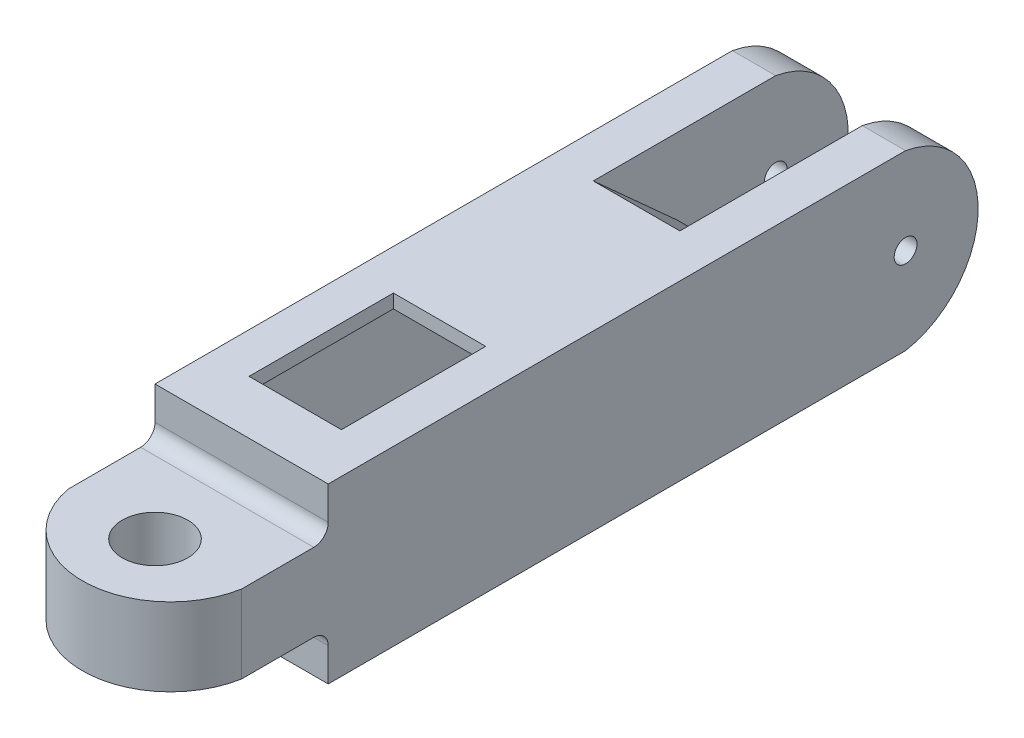
ISO-10303-21;
HEADER;
FILE_DESCRIPTION(('STEP AP214'),'2;1');
FILE_NAME('part.step','',(''),(''),'','','');
FILE_SCHEMA(('AUTOMOTIVE_DESIGN { 1 0 10303 214 1 1 1 1 }'));
ENDSEC;
DATA;
#1=APPLICATION_CONTEXT('core data for automotive mechanical design processes');
#2=APPLICATION_PROTOCOL_DEFINITION('international standard','automotive_design',2000,#1);
#3=PRODUCT_CONTEXT('',#1,'mechanical');
#4=PRODUCT('Part','Part','',(#3));
#5=PRODUCT_RELATED_PRODUCT_CATEGORY('part','',(#4));
#6=PRODUCT_DEFINITION_FORMATION('','',#4);
#7=PRODUCT_DEFINITION_CONTEXT('part definition',#1,'design');
#8=PRODUCT_DEFINITION('design','',#6,#7);
#9=PRODUCT_DEFINITION_SHAPE('','',#8);
#10=(LENGTH_UNIT() NAMED_UNIT(*) SI_UNIT(.MILLI.,.METRE.));
#11=(NAMED_UNIT(*) PLANE_ANGLE_UNIT() SI_UNIT($,.RADIAN.));
#12=(NAMED_UNIT(*) SI_UNIT($,.STERADIAN.) SOLID_ANGLE_UNIT());
#13=UNCERTAINTY_MEASURE_WITH_UNIT(LENGTH_MEASURE(1.E-05),#10,'distance_accuracy_value','');
#14=(GEOMETRIC_REPRESENTATION_CONTEXT(3) GLOBAL_UNCERTAINTY_ASSIGNED_CONTEXT((#13)) GLOBAL_UNIT_ASSIGNED_CONTEXT((#10,
#11,#12)) REPRESENTATION_CONTEXT('',''));
#15=CARTESIAN_POINT('',(0.,0.,0.));
#16=DIRECTION('',(0.,0.,1.));
#17=DIRECTION('',(1.,0.,0.));
#18=AXIS2_PLACEMENT_3D('',#15,#16,#17);
#19=CARTESIAN_POINT('',(0.,0.,170.));
#20=DIRECTION('',(0.,0.,1.));
#21=DIRECTION('',(1.,0.,0.));
#22=AXIS2_PLACEMENT_3D('',#19,#20,#21);
#23=PLANE('',#22);
#24=DIRECTION('',(0.,1.,0.));
#25=VECTOR('',#24,1.);
#26=CARTESIAN_POINT('',(30.,30.,170.));
#27=LINE('',#26,#25);
#28=CARTESIAN_POINT('',(30.,-30.,170.));
#29=VERTEX_POINT('',#28);
#30=CARTESIAN_POINT('',(30.,-18.5,170.));
#31=VERTEX_POINT('',#30);
#32=EDGE_CURVE('E481',#29,#31,#27,.T.);
#33=ORIENTED_EDGE('',*,*,#32,.T.);
#34=DIRECTION('',(1.,0.,0.));
#35=VECTOR('',#34,1.);
#36=CARTESIAN_POINT('',(0.,-18.5,170.));
#37=LINE('',#36,#35);
#38=CARTESIAN_POINT('',(-30.,-18.5,170.));
#39=VERTEX_POINT('',#38);
#40=EDGE_CURVE('E527',#31,#39,#37,.F.);
#41=ORIENTED_EDGE('',*,*,#40,.T.);
#42=DIRECTION('',(0.,-1.,0.));
#43=VECTOR('',#42,1.);
#44=CARTESIAN_POINT('',(-30.,30.,170.));
#45=LINE('',#44,#43);
#46=CARTESIAN_POINT('',(-30.,-30.,170.));
#47=VERTEX_POINT('',#46);
#48=EDGE_CURVE('E488',#39,#47,#45,.T.);
#49=ORIENTED_EDGE('',*,*,#48,.T.);
#50=DIRECTION('',(1.,0.,0.));
#51=VECTOR('',#50,1.);
#52=CARTESIAN_POINT('',(-30.,-30.,170.));
#53=LINE('',#52,#51);
#54=EDGE_CURVE('E493',#47,#29,#53,.T.);
#55=ORIENTED_EDGE('',*,*,#54,.T.);
#56=EDGE_LOOP('',(#33,#41,#49,#55));
#57=FACE_BOUND('',#56,.T.);
#58=ADVANCED_FACE('F57',(#57),#23,.T.);
#59=CARTESIAN_POINT('',(30.,30.,170.));
#60=DIRECTION('',(-1.,0.,0.));
#61=DIRECTION('',(0.,-1.,0.));
#62=AXIS2_PLACEMENT_3D('',#59,#60,#61);
#63=PLANE('',#62);
#64=CARTESIAN_POINT('',(30.,0.,-30.));
#65=DIRECTION('',(-1.,0.,0.));
#66=DIRECTION('',(0.,-1.,0.));
#67=AXIS2_PLACEMENT_3D('',#64,#65,#66);
#68=CIRCLE('',#67,3.95);
#69=CARTESIAN_POINT('',(30.,-3.95000000000001,-30.));
#70=VERTEX_POINT('',#69);
#71=EDGE_CURVE('E347',#70,#70,#68,.T.);
#72=ORIENTED_EDGE('',*,*,#71,.T.);
#73=EDGE_LOOP('',(#72));
#74=FACE_BOUND('',#73,.T.);
#75=DIRECTION('',(0.,0.,-1.));
#76=VECTOR('',#75,1.);
#77=CARTESIAN_POINT('',(30.,-30.,170.));
#78=LINE('',#77,#76);
#79=CARTESIAN_POINT('',(30.,-30.,-30.));
#80=VERTEX_POINT('',#79);
#81=EDGE_CURVE('E496',#29,#80,#78,.T.);
#82=ORIENTED_EDGE('',*,*,#81,.T.);
#83=CARTESIAN_POINT('',(30.,0.,-24.6688744152853));
#84=DIRECTION('',(1.,0.,0.));
#85=DIRECTION('',(0.,-1.,0.));
#86=AXIS2_PLACEMENT_3D('',#83,#84,#85);
#87=CIRCLE('',#86,30.47);
#88=CARTESIAN_POINT('',(30.,30.,-30.));
#89=VERTEX_POINT('',#88);
#90=EDGE_CURVE('E441',#80,#89,#87,.T.);
#91=ORIENTED_EDGE('',*,*,#90,.T.);
#92=DIRECTION('',(0.,0.,-1.));
#93=VECTOR('',#92,1.);
#94=CARTESIAN_POINT('',(30.,30.,170.));
#95=LINE('',#94,#93);
#96=CARTESIAN_POINT('',(30.,30.,170.));
#97=VERTEX_POINT('',#96);
#98=EDGE_CURVE('E507',#97,#89,#95,.T.);
#99=ORIENTED_EDGE('',*,*,#98,.F.);
#100=CARTESIAN_POINT('',(30.,18.5,170.));
#101=VERTEX_POINT('',#100);
#102=EDGE_CURVE('E480',#101,#97,#27,.T.);
#103=ORIENTED_EDGE('',*,*,#102,.F.);
#104=CARTESIAN_POINT('',(30.,18.5,175.));
#105=DIRECTION('',(-1.,0.,0.));
#106=DIRECTION('',(0.,-1.,0.));
#107=AXIS2_PLACEMENT_3D('',#104,#105,#106);
#108=CIRCLE('',#107,5.);
#109=CARTESIAN_POINT('',(30.,13.5,175.));
#110=VERTEX_POINT('',#109);
#111=EDGE_CURVE('E546',#101,#110,#108,.T.);
#112=ORIENTED_EDGE('',*,*,#111,.T.);
#113=DIRECTION('',(0.,0.,-1.));
#114=VECTOR('',#113,1.);
#115=CARTESIAN_POINT('',(30.,13.5,200.));
#116=LINE('',#115,#114);
#117=CARTESIAN_POINT('',(30.,13.5,200.));
#118=VERTEX_POINT('',#117);
#119=EDGE_CURVE('E432',#118,#110,#116,.T.);
#120=ORIENTED_EDGE('',*,*,#119,.F.);
#121=DIRECTION('',(0.,1.,0.));
#122=VECTOR('',#121,1.);
#123=CARTESIAN_POINT('',(30.,13.5,200.));
#124=LINE('',#123,#122);
#125=CARTESIAN_POINT('',(30.,-13.5,200.));
#126=VERTEX_POINT('',#125);
#127=EDGE_CURVE('E409',#126,#118,#124,.T.);
#128=ORIENTED_EDGE('',*,*,#127,.F.);
#129=DIRECTION('',(0.,0.,-1.));
#130=VECTOR('',#129,1.);
#131=CARTESIAN_POINT('',(30.,-13.5,200.));
#132=LINE('',#131,#130);
#133=CARTESIAN_POINT('',(30.,-13.5,175.));
#134=VERTEX_POINT('',#133);
#135=EDGE_CURVE('E420',#126,#134,#132,.T.);
#136=ORIENTED_EDGE('',*,*,#135,.T.);
#137=CARTESIAN_POINT('',(30.,-18.5,175.));
#138=DIRECTION('',(-1.,0.,0.));
#139=DIRECTION('',(0.,-1.,0.));
#140=AXIS2_PLACEMENT_3D('',#137,#138,#139);
#141=CIRCLE('',#140,5.);
#142=EDGE_CURVE('E537',#134,#31,#141,.T.);
#143=ORIENTED_EDGE('',*,*,#142,.T.);
#144=ORIENTED_EDGE('',*,*,#32,.F.);
#145=EDGE_LOOP('',(#82,#91,#99,#103,#112,#120,#128,#136,#143,#144));
#146=FACE_BOUND('',#145,.T.);
#147=ADVANCED_FACE('F575',(#74,#146),#63,.F.);
#148=CARTESIAN_POINT('',(-30.,30.,170.));
#149=DIRECTION('',(0.,-1.,0.));
#150=DIRECTION('',(0.,0.,-1.));
#151=AXIS2_PLACEMENT_3D('',#148,#149,#150);
#152=PLANE('',#151);
#153=DIRECTION('',(-1.,0.,0.));
#154=VECTOR('',#153,1.);
#155=CARTESIAN_POINT('',(0.,30.,151.43));
#156=LINE('',#155,#154);
#157=CARTESIAN_POINT('',(16.,30.,151.43));
#158=VERTEX_POINT('',#157);
#159=CARTESIAN_POINT('',(-16.,30.,151.43));
#160=VERTEX_POINT('',#159);
#161=EDGE_CURVE('E259',#158,#160,#156,.T.);
#162=ORIENTED_EDGE('',*,*,#161,.T.);
#163=DIRECTION('',(0.,0.,1.));
#164=VECTOR('',#163,1.);
#165=CARTESIAN_POINT('',(-16.,30.,0.));
#166=LINE('',#165,#164);
#167=CARTESIAN_POINT('',(-16.,30.,101.43));
#168=VERTEX_POINT('',#167);
#169=EDGE_CURVE('E73',#168,#160,#166,.T.);
#170=ORIENTED_EDGE('',*,*,#169,.F.);
#171=DIRECTION('',(-1.,0.,0.));
#172=VECTOR('',#171,1.);
#173=CARTESIAN_POINT('',(0.,30.,101.43));
#174=LINE('',#173,#172);
#175=CARTESIAN_POINT('',(16.,30.,101.43));
#176=VERTEX_POINT('',#175);
#177=EDGE_CURVE('E268',#176,#168,#174,.T.);
#178=ORIENTED_EDGE('',*,*,#177,.F.);
#179=DIRECTION('',(0.,0.,1.));
#180=VECTOR('',#179,1.);
#181=CARTESIAN_POINT('',(16.,30.,0.));
#182=LINE('',#181,#180);
#183=EDGE_CURVE('E249',#176,#158,#182,.T.);
#184=ORIENTED_EDGE('',*,*,#183,.T.);
#185=EDGE_LOOP('',(#162,#170,#178,#184));
#186=FACE_BOUND('',#185,.T.);
#187=DIRECTION('',(0.,0.,1.));
#188=VECTOR('',#187,1.);
#189=CARTESIAN_POINT('',(15.,30.,-30.));
#190=LINE('',#189,#188);
#191=CARTESIAN_POINT('',(15.,30.,-30.));
#192=VERTEX_POINT('',#191);
#193=CARTESIAN_POINT('',(15.,30.,33.188384016313));
#194=VERTEX_POINT('',#193);
#195=EDGE_CURVE('E460',#192,#194,#190,.T.);
#196=ORIENTED_EDGE('',*,*,#195,.T.);
#197=DIRECTION('',(-1.,0.,0.));
#198=VECTOR('',#197,1.);
#199=CARTESIAN_POINT('',(15.,30.,33.188384016313));
#200=LINE('',#199,#198);
#201=CARTESIAN_POINT('',(-15.,30.,33.188384016313));
#202=VERTEX_POINT('',#201);
#203=EDGE_CURVE('E319',#194,#202,#200,.T.);
#204=ORIENTED_EDGE('',*,*,#203,.T.);
#205=DIRECTION('',(0.,0.,1.));
#206=VECTOR('',#205,1.);
#207=CARTESIAN_POINT('',(-15.,30.,-30.));
#208=LINE('',#207,#206);
#209=CARTESIAN_POINT('',(-15.,30.,-30.));
#210=VERTEX_POINT('',#209);
#211=EDGE_CURVE('E477',#210,#202,#208,.T.);
#212=ORIENTED_EDGE('',*,*,#211,.F.);
#213=DIRECTION('',(1.,0.,0.));
#214=VECTOR('',#213,1.);
#215=CARTESIAN_POINT('',(-30.,30.,-30.));
#216=LINE('',#215,#214);
#217=CARTESIAN_POINT('',(-30.,30.,-30.));
#218=VERTEX_POINT('',#217);
#219=EDGE_CURVE('E466',#218,#210,#216,.T.);
#220=ORIENTED_EDGE('',*,*,#219,.F.);
#221=DIRECTION('',(0.,0.,-1.));
#222=VECTOR('',#221,1.);
#223=CARTESIAN_POINT('',(-30.,30.,170.));
#224=LINE('',#223,#222);
#225=CARTESIAN_POINT('',(-30.,30.,170.));
#226=VERTEX_POINT('',#225);
#227=EDGE_CURVE('E503',#226,#218,#224,.T.);
#228=ORIENTED_EDGE('',*,*,#227,.F.);
#229=DIRECTION('',(-1.,0.,0.));
#230=VECTOR('',#229,1.);
#231=CARTESIAN_POINT('',(-30.,30.,170.));
#232=LINE('',#231,#230);
#233=EDGE_CURVE('E485',#97,#226,#232,.T.);
#234=ORIENTED_EDGE('',*,*,#233,.F.);
#235=ORIENTED_EDGE('',*,*,#98,.T.);
#236=DIRECTION('',(1.,0.,0.));
#237=VECTOR('',#236,1.);
#238=CARTESIAN_POINT('',(30.,30.,-30.));
#239=LINE('',#238,#237);
#240=EDGE_CURVE('E456',#192,#89,#239,.T.);
#241=ORIENTED_EDGE('',*,*,#240,.F.);
#242=EDGE_LOOP('',(#196,#204,#212,#220,#228,#234,#235,#241));
#243=FACE_BOUND('',#242,.T.);
#244=ADVANCED_FACE('F265',(#186,#243),#152,.F.);
#245=CARTESIAN_POINT('',(-30.,30.,170.));
#246=DIRECTION('',(1.,0.,0.));
#247=DIRECTION('',(0.,1.,0.));
#248=AXIS2_PLACEMENT_3D('',#245,#246,#247);
#249=PLANE('',#248);
#250=CARTESIAN_POINT('',(-30.,0.,-30.));
#251=DIRECTION('',(1.,0.,0.));
#252=DIRECTION('',(0.,1.,0.));
#253=AXIS2_PLACEMENT_3D('',#250,#251,#252);
#254=CIRCLE('',#253,3.95);
#255=CARTESIAN_POINT('',(-30.,3.95,-30.));
#256=VERTEX_POINT('',#255);
#257=EDGE_CURVE('E339',#256,#256,#254,.T.);
#258=ORIENTED_EDGE('',*,*,#257,.T.);
#259=EDGE_LOOP('',(#258));
#260=FACE_BOUND('',#259,.T.);
#261=ORIENTED_EDGE('',*,*,#227,.T.);
#262=CARTESIAN_POINT('',(-30.,0.,-24.6688744152853));
#263=DIRECTION('',(-1.,0.,0.));
#264=DIRECTION('',(0.,1.,0.));
#265=AXIS2_PLACEMENT_3D('',#262,#263,#264);
#266=CIRCLE('',#265,30.47);
#267=CARTESIAN_POINT('',(-30.,-30.,-30.));
#268=VERTEX_POINT('',#267);
#269=EDGE_CURVE('E436',#218,#268,#266,.T.);
#270=ORIENTED_EDGE('',*,*,#269,.T.);
#271=DIRECTION('',(0.,0.,-1.));
#272=VECTOR('',#271,1.);
#273=CARTESIAN_POINT('',(-30.,-30.,170.));
#274=LINE('',#273,#272);
#275=EDGE_CURVE('E500',#47,#268,#274,.T.);
#276=ORIENTED_EDGE('',*,*,#275,.F.);
#277=ORIENTED_EDGE('',*,*,#48,.F.);
#278=CARTESIAN_POINT('',(-30.,-18.5,175.));
#279=DIRECTION('',(1.,0.,0.));
#280=DIRECTION('',(0.,1.,0.));
#281=AXIS2_PLACEMENT_3D('',#278,#279,#280);
#282=CIRCLE('',#281,5.);
#283=CARTESIAN_POINT('',(-30.,-13.5,175.));
#284=VERTEX_POINT('',#283);
#285=EDGE_CURVE('E540',#39,#284,#282,.T.);
#286=ORIENTED_EDGE('',*,*,#285,.T.);
#287=DIRECTION('',(0.,0.,-1.));
#288=VECTOR('',#287,1.);
#289=CARTESIAN_POINT('',(-30.,-13.5,200.));
#290=LINE('',#289,#288);
#291=CARTESIAN_POINT('',(-30.,-13.5,200.));
#292=VERTEX_POINT('',#291);
#293=EDGE_CURVE('E424',#292,#284,#290,.T.);
#294=ORIENTED_EDGE('',*,*,#293,.F.);
#295=DIRECTION('',(0.,-1.,0.));
#296=VECTOR('',#295,1.);
#297=CARTESIAN_POINT('',(-30.,13.5,200.));
#298=LINE('',#297,#296);
#299=CARTESIAN_POINT('',(-30.,13.5,200.));
#300=VERTEX_POINT('',#299);
#301=EDGE_CURVE('E416',#300,#292,#298,.T.);
#302=ORIENTED_EDGE('',*,*,#301,.F.);
#303=DIRECTION('',(0.,0.,-1.));
#304=VECTOR('',#303,1.);
#305=CARTESIAN_POINT('',(-30.,13.5,200.));
#306=LINE('',#305,#304);
#307=CARTESIAN_POINT('',(-30.,13.5,175.));
#308=VERTEX_POINT('',#307);
#309=EDGE_CURVE('E428',#300,#308,#306,.T.);
#310=ORIENTED_EDGE('',*,*,#309,.T.);
#311=CARTESIAN_POINT('',(-30.,18.5,175.));
#312=DIRECTION('',(1.,0.,0.));
#313=DIRECTION('',(0.,1.,0.));
#314=AXIS2_PLACEMENT_3D('',#311,#312,#313);
#315=CIRCLE('',#314,5.);
#316=CARTESIAN_POINT('',(-30.,18.5,170.));
#317=VERTEX_POINT('',#316);
#318=EDGE_CURVE('E543',#308,#317,#315,.T.);
#319=ORIENTED_EDGE('',*,*,#318,.T.);
#320=EDGE_CURVE('E489',#226,#317,#45,.T.);
#321=ORIENTED_EDGE('',*,*,#320,.F.);
#322=EDGE_LOOP('',(#261,#270,#276,#277,#286,#294,#302,#310,#319,#321));
#323=FACE_BOUND('',#322,.T.);
#324=ADVANCED_FACE('F596',(#260,#323),#249,.F.);
#325=CARTESIAN_POINT('',(-30.,-30.,170.));
#326=DIRECTION('',(0.,1.,0.));
#327=DIRECTION('',(0.,0.,1.));
#328=AXIS2_PLACEMENT_3D('',#325,#326,#327);
#329=PLANE('',#328);
#330=DIRECTION('',(-1.,0.,0.));
#331=VECTOR('',#330,1.);
#332=CARTESIAN_POINT('',(-30.,-30.,101.43));
#333=LINE('',#332,#331);
#334=CARTESIAN_POINT('',(16.,-30.,101.43));
#335=VERTEX_POINT('',#334);
#336=CARTESIAN_POINT('',(-16.,-30.,101.43));
#337=VERTEX_POINT('',#336);
#338=EDGE_CURVE('E302',#335,#337,#333,.T.);
#339=ORIENTED_EDGE('',*,*,#338,.T.);
#340=DIRECTION('',(0.,0.,1.));
#341=VECTOR('',#340,1.);
#342=CARTESIAN_POINT('',(-16.,-30.,170.));
#343=LINE('',#342,#341);
#344=CARTESIAN_POINT('',(-16.,-30.,151.43));
#345=VERTEX_POINT('',#344);
#346=EDGE_CURVE('E310',#337,#345,#343,.T.);
#347=ORIENTED_EDGE('',*,*,#346,.T.);
#348=DIRECTION('',(-1.,0.,0.));
#349=VECTOR('',#348,1.);
#350=CARTESIAN_POINT('',(-30.,-30.,151.43));
#351=LINE('',#350,#349);
#352=CARTESIAN_POINT('',(16.,-30.,151.43));
#353=VERTEX_POINT('',#352);
#354=EDGE_CURVE('E289',#353,#345,#351,.T.);
#355=ORIENTED_EDGE('',*,*,#354,.F.);
#356=DIRECTION('',(0.,0.,1.));
#357=VECTOR('',#356,1.);
#358=CARTESIAN_POINT('',(16.,-30.,170.));
#359=LINE('',#358,#357);
#360=EDGE_CURVE('E296',#335,#353,#359,.T.);
#361=ORIENTED_EDGE('',*,*,#360,.F.);
#362=EDGE_LOOP('',(#339,#347,#355,#361));
#363=FACE_BOUND('',#362,.T.);
#364=DIRECTION('',(-1.,0.,0.));
#365=VECTOR('',#364,1.);
#366=CARTESIAN_POINT('',(15.,-30.,33.188384016313));
#367=LINE('',#366,#365);
#368=CARTESIAN_POINT('',(15.,-30.,33.188384016313));
#369=VERTEX_POINT('',#368);
#370=CARTESIAN_POINT('',(-15.,-30.,33.188384016313));
#371=VERTEX_POINT('',#370);
#372=EDGE_CURVE('E331',#369,#371,#367,.T.);
#373=ORIENTED_EDGE('',*,*,#372,.F.);
#374=DIRECTION('',(0.,0.,1.));
#375=VECTOR('',#374,1.);
#376=CARTESIAN_POINT('',(15.,-30.,-30.));
#377=LINE('',#376,#375);
#378=CARTESIAN_POINT('',(15.,-30.,-30.));
#379=VERTEX_POINT('',#378);
#380=EDGE_CURVE('E463',#379,#369,#377,.T.);
#381=ORIENTED_EDGE('',*,*,#380,.F.);
#382=DIRECTION('',(-1.,0.,0.));
#383=VECTOR('',#382,1.);
#384=CARTESIAN_POINT('',(30.,-30.,-30.));
#385=LINE('',#384,#383);
#386=EDGE_CURVE('E449',#80,#379,#385,.T.);
#387=ORIENTED_EDGE('',*,*,#386,.F.);
#388=ORIENTED_EDGE('',*,*,#81,.F.);
#389=ORIENTED_EDGE('',*,*,#54,.F.);
#390=ORIENTED_EDGE('',*,*,#275,.T.);
#391=DIRECTION('',(-1.,0.,0.));
#392=VECTOR('',#391,1.);
#393=CARTESIAN_POINT('',(-30.,-30.,-30.));
#394=LINE('',#393,#392);
#395=CARTESIAN_POINT('',(-15.,-30.,-30.));
#396=VERTEX_POINT('',#395);
#397=EDGE_CURVE('E470',#396,#268,#394,.T.);
#398=ORIENTED_EDGE('',*,*,#397,.F.);
#399=DIRECTION('',(0.,0.,1.));
#400=VECTOR('',#399,1.);
#401=CARTESIAN_POINT('',(-15.,-30.,-30.));
#402=LINE('',#401,#400);
#403=EDGE_CURVE('E474',#396,#371,#402,.T.);
#404=ORIENTED_EDGE('',*,*,#403,.T.);
#405=EDGE_LOOP('',(#373,#381,#387,#388,#389,#390,#398,#404));
#406=FACE_BOUND('',#405,.T.);
#407=ADVANCED_FACE('F588',(#363,#406),#329,.F.);
#408=ORIENTED_EDGE('',*,*,#320,.T.);
#409=DIRECTION('',(-1.,0.,0.));
#410=VECTOR('',#409,1.);
#411=CARTESIAN_POINT('',(0.,18.5,170.));
#412=LINE('',#411,#410);
#413=EDGE_CURVE('E534',#317,#101,#412,.F.);
#414=ORIENTED_EDGE('',*,*,#413,.T.);
#415=ORIENTED_EDGE('',*,*,#102,.T.);
#416=ORIENTED_EDGE('',*,*,#233,.T.);
#417=EDGE_LOOP('',(#408,#414,#415,#416));
#418=FACE_BOUND('',#417,.T.);
#419=ADVANCED_FACE('F578',(#418),#23,.T.);
#420=CARTESIAN_POINT('',(-15.,-30.,-30.));
#421=DIRECTION('',(-1.,0.,0.));
#422=DIRECTION('',(0.,-1.,0.));
#423=AXIS2_PLACEMENT_3D('',#420,#421,#422);
#424=PLANE('',#423);
#425=CARTESIAN_POINT('',(-15.,0.,-30.));
#426=DIRECTION('',(1.,0.,0.));
#427=DIRECTION('',(0.,1.,0.));
#428=AXIS2_PLACEMENT_3D('',#425,#426,#427);
#429=CIRCLE('',#428,3.95);
#430=CARTESIAN_POINT('',(-15.,3.95,-30.));
#431=VERTEX_POINT('',#430);
#432=EDGE_CURVE('E338',#431,#431,#429,.T.);
#433=ORIENTED_EDGE('',*,*,#432,.F.);
#434=EDGE_LOOP('',(#433));
#435=FACE_BOUND('',#434,.T.);
#436=ORIENTED_EDGE('',*,*,#211,.T.);
#437=DIRECTION('',(0.,-0.670574197963424,-0.74184246644804));
#438=VECTOR('',#437,1.);
#439=CARTESIAN_POINT('',(-15.,0.,0.));
#440=LINE('',#439,#438);
#441=CARTESIAN_POINT('',(-15.,3.7092123322402,4.10342544268105));
#442=VERTEX_POINT('',#441);
#443=EDGE_CURVE('E314',#202,#442,#440,.T.);
#444=ORIENTED_EDGE('',*,*,#443,.T.);
#445=CARTESIAN_POINT('',(-15.,0.,7.45629643249817));
#446=DIRECTION('',(-1.,0.,0.));
#447=DIRECTION('',(0.,-1.,0.));
#448=AXIS2_PLACEMENT_3D('',#445,#446,#447);
#449=CIRCLE('',#448,5.);
#450=CARTESIAN_POINT('',(-15.,-3.7092123322402,4.10342544268105));
#451=VERTEX_POINT('',#450);
#452=EDGE_CURVE('E517',#442,#451,#449,.T.);
#453=ORIENTED_EDGE('',*,*,#452,.T.);
#454=DIRECTION('',(0.,0.670574197963424,-0.74184246644804));
#455=VECTOR('',#454,1.);
#456=CARTESIAN_POINT('',(-15.,0.,0.));
#457=LINE('',#456,#455);
#458=EDGE_CURVE('E326',#371,#451,#457,.T.);
#459=ORIENTED_EDGE('',*,*,#458,.F.);
#460=ORIENTED_EDGE('',*,*,#403,.F.);
#461=CARTESIAN_POINT('',(-15.,0.,-24.6688744152853));
#462=DIRECTION('',(-1.,0.,0.));
#463=DIRECTION('',(0.,1.,0.));
#464=AXIS2_PLACEMENT_3D('',#461,#462,#463);
#465=CIRCLE('',#464,30.47);
#466=EDGE_CURVE('E437',#210,#396,#465,.T.);
#467=ORIENTED_EDGE('',*,*,#466,.F.);
#468=EDGE_LOOP('',(#436,#444,#453,#459,#460,#467));
#469=FACE_BOUND('',#468,.T.);
#470=ADVANCED_FACE('F587',(#435,#469),#424,.F.);
#471=CARTESIAN_POINT('',(15.,30.,-30.));
#472=DIRECTION('',(1.,0.,0.));
#473=DIRECTION('',(0.,1.,0.));
#474=AXIS2_PLACEMENT_3D('',#471,#472,#473);
#475=PLANE('',#474);
#476=CARTESIAN_POINT('',(15.,0.,-30.));
#477=DIRECTION('',(-1.,0.,0.));
#478=DIRECTION('',(0.,-1.,0.));
#479=AXIS2_PLACEMENT_3D('',#476,#477,#478);
#480=CIRCLE('',#479,3.95);
#481=CARTESIAN_POINT('',(15.,-3.95,-30.));
#482=VERTEX_POINT('',#481);
#483=EDGE_CURVE('E343',#482,#482,#480,.T.);
#484=ORIENTED_EDGE('',*,*,#483,.F.);
#485=EDGE_LOOP('',(#484));
#486=FACE_BOUND('',#485,.T.);
#487=ORIENTED_EDGE('',*,*,#380,.T.);
#488=DIRECTION('',(0.,0.670574197963424,-0.74184246644804));
#489=VECTOR('',#488,1.);
#490=CARTESIAN_POINT('',(15.,0.,0.));
#491=LINE('',#490,#489);
#492=CARTESIAN_POINT('',(15.,-3.7092123322402,4.10342544268105));
#493=VERTEX_POINT('',#492);
#494=EDGE_CURVE('E327',#369,#493,#491,.T.);
#495=ORIENTED_EDGE('',*,*,#494,.T.);
#496=CARTESIAN_POINT('',(15.,0.,7.45629643249817));
#497=DIRECTION('',(1.,0.,0.));
#498=DIRECTION('',(0.,1.,0.));
#499=AXIS2_PLACEMENT_3D('',#496,#497,#498);
#500=CIRCLE('',#499,5.);
#501=CARTESIAN_POINT('',(15.,3.7092123322402,4.10342544268105));
#502=VERTEX_POINT('',#501);
#503=EDGE_CURVE('E520',#493,#502,#500,.T.);
#504=ORIENTED_EDGE('',*,*,#503,.T.);
#505=DIRECTION('',(0.,-0.670574197963424,-0.74184246644804));
#506=VECTOR('',#505,1.);
#507=CARTESIAN_POINT('',(15.,0.,0.));
#508=LINE('',#507,#506);
#509=EDGE_CURVE('E315',#194,#502,#508,.T.);
#510=ORIENTED_EDGE('',*,*,#509,.F.);
#511=ORIENTED_EDGE('',*,*,#195,.F.);
#512=CARTESIAN_POINT('',(15.,0.,-24.6688744152853));
#513=DIRECTION('',(1.,0.,0.));
#514=DIRECTION('',(0.,-1.,0.));
#515=AXIS2_PLACEMENT_3D('',#512,#513,#514);
#516=CIRCLE('',#515,30.47);
#517=EDGE_CURVE('E445',#379,#192,#516,.T.);
#518=ORIENTED_EDGE('',*,*,#517,.F.);
#519=EDGE_LOOP('',(#487,#495,#504,#510,#511,#518));
#520=FACE_BOUND('',#519,.T.);
#521=ADVANCED_FACE('F594',(#486,#520),#475,.F.);
#522=CARTESIAN_POINT('',(15.,0.,-24.6688744152853));
#523=DIRECTION('',(1.,0.,0.));
#524=DIRECTION('',(0.,1.,0.));
#525=AXIS2_PLACEMENT_3D('',#522,#523,#524);
#526=CYLINDRICAL_SURFACE('',#525,30.47);
#527=ORIENTED_EDGE('',*,*,#90,.F.);
#528=ORIENTED_EDGE('',*,*,#386,.T.);
#529=ORIENTED_EDGE('',*,*,#517,.T.);
#530=ORIENTED_EDGE('',*,*,#240,.T.);
#531=EDGE_LOOP('',(#527,#528,#529,#530));
#532=FACE_BOUND('',#531,.T.);
#533=ADVANCED_FACE('F674',(#532),#526,.T.);
#534=CARTESIAN_POINT('',(-15.,0.,-24.6688744152853));
#535=DIRECTION('',(-1.,0.,0.));
#536=DIRECTION('',(0.,-1.,0.));
#537=AXIS2_PLACEMENT_3D('',#534,#535,#536);
#538=CYLINDRICAL_SURFACE('',#537,30.47);
#539=ORIENTED_EDGE('',*,*,#269,.F.);
#540=ORIENTED_EDGE('',*,*,#219,.T.);
#541=ORIENTED_EDGE('',*,*,#466,.T.);
#542=ORIENTED_EDGE('',*,*,#397,.T.);
#543=EDGE_LOOP('',(#539,#540,#541,#542));
#544=FACE_BOUND('',#543,.T.);
#545=ADVANCED_FACE('F678',(#544),#538,.T.);
#546=CARTESIAN_POINT('',(-30.,13.5,200.));
#547=DIRECTION('',(0.,-1.,0.));
#548=DIRECTION('',(0.,0.,-1.));
#549=AXIS2_PLACEMENT_3D('',#546,#547,#548);
#550=PLANE('',#549);
#551=CARTESIAN_POINT('',(0.,13.5,200.));
#552=DIRECTION('',(0.,-1.,0.));
#553=DIRECTION('',(0.,0.,-1.));
#554=AXIS2_PLACEMENT_3D('',#551,#552,#553);
#555=CIRCLE('',#554,11.35);
#556=CARTESIAN_POINT('',(0.,13.5,188.65));
#557=VERTEX_POINT('',#556);
#558=EDGE_CURVE('E358',#557,#557,#555,.T.);
#559=ORIENTED_EDGE('',*,*,#558,.T.);
#560=EDGE_LOOP('',(#559));
#561=FACE_BOUND('',#560,.T.);
#562=ORIENTED_EDGE('',*,*,#119,.T.);
#563=DIRECTION('',(-1.,0.,0.));
#564=VECTOR('',#563,1.);
#565=CARTESIAN_POINT('',(-30.,13.5,175.));
#566=LINE('',#565,#564);
#567=EDGE_CURVE('E530',#110,#308,#566,.T.);
#568=ORIENTED_EDGE('',*,*,#567,.T.);
#569=ORIENTED_EDGE('',*,*,#309,.F.);
#570=CARTESIAN_POINT('',(0.,13.5,194.668874415285));
#571=DIRECTION('',(0.,1.,0.));
#572=DIRECTION('',(0.,0.,-1.));
#573=AXIS2_PLACEMENT_3D('',#570,#571,#572);
#574=CIRCLE('',#573,30.47);
#575=EDGE_CURVE('E396',#300,#118,#574,.T.);
#576=ORIENTED_EDGE('',*,*,#575,.T.);
#577=EDGE_LOOP('',(#562,#568,#569,#576));
#578=FACE_BOUND('',#577,.T.);
#579=ADVANCED_FACE('F611',(#561,#578),#550,.F.);
#580=CARTESIAN_POINT('',(-30.,-13.5,200.));
#581=DIRECTION('',(0.,1.,0.));
#582=DIRECTION('',(0.,0.,1.));
#583=AXIS2_PLACEMENT_3D('',#580,#581,#582);
#584=PLANE('',#583);
#585=CARTESIAN_POINT('',(0.,-13.5,200.));
#586=DIRECTION('',(0.,-1.,0.));
#587=DIRECTION('',(0.,0.,-1.));
#588=AXIS2_PLACEMENT_3D('',#585,#586,#587);
#589=CIRCLE('',#588,11.35);
#590=CARTESIAN_POINT('',(0.,-13.5,188.65));
#591=VERTEX_POINT('',#590);
#592=EDGE_CURVE('E351',#591,#591,#589,.T.);
#593=ORIENTED_EDGE('',*,*,#592,.F.);
#594=EDGE_LOOP('',(#593));
#595=FACE_BOUND('',#594,.T.);
#596=ORIENTED_EDGE('',*,*,#293,.T.);
#597=DIRECTION('',(1.,0.,0.));
#598=VECTOR('',#597,1.);
#599=CARTESIAN_POINT('',(-30.,-13.5,175.));
#600=LINE('',#599,#598);
#601=EDGE_CURVE('E523',#284,#134,#600,.T.);
#602=ORIENTED_EDGE('',*,*,#601,.T.);
#603=ORIENTED_EDGE('',*,*,#135,.F.);
#604=CARTESIAN_POINT('',(0.,-13.5,194.668874415285));
#605=DIRECTION('',(0.,1.,0.));
#606=DIRECTION('',(0.,0.,-1.));
#607=AXIS2_PLACEMENT_3D('',#604,#605,#606);
#608=CIRCLE('',#607,30.47);
#609=EDGE_CURVE('E405',#292,#126,#608,.T.);
#610=ORIENTED_EDGE('',*,*,#609,.F.);
#611=EDGE_LOOP('',(#596,#602,#603,#610));
#612=FACE_BOUND('',#611,.T.);
#613=ADVANCED_FACE('F619',(#595,#612),#584,.F.);
#614=CARTESIAN_POINT('',(0.,-13.5,194.668874415285));
#615=DIRECTION('',(0.,1.,0.));
#616=DIRECTION('',(0.,0.,1.));
#617=AXIS2_PLACEMENT_3D('',#614,#615,#616);
#618=CYLINDRICAL_SURFACE('',#617,30.47);
#619=ORIENTED_EDGE('',*,*,#575,.F.);
#620=ORIENTED_EDGE('',*,*,#301,.T.);
#621=ORIENTED_EDGE('',*,*,#609,.T.);
#622=ORIENTED_EDGE('',*,*,#127,.T.);
#623=EDGE_LOOP('',(#619,#620,#621,#622));
#624=FACE_BOUND('',#623,.T.);
#625=ADVANCED_FACE('F615',(#624),#618,.T.);
#626=CARTESIAN_POINT('',(0.,116.5,200.));
#627=DIRECTION('',(0.,-1.,0.));
#628=DIRECTION('',(0.,0.,-1.));
#629=AXIS2_PLACEMENT_3D('',#626,#627,#628);
#630=CYLINDRICAL_SURFACE('',#629,11.35);
#631=ORIENTED_EDGE('',*,*,#592,.T.);
#632=EDGE_LOOP('',(#631));
#633=FACE_BOUND('',#632,.T.);
#634=ORIENTED_EDGE('',*,*,#558,.F.);
#635=EDGE_LOOP('',(#634));
#636=FACE_BOUND('',#635,.T.);
#637=ADVANCED_FACE('F699',(#633,#636),#630,.F.);
#638=CARTESIAN_POINT('',(30.,0.,-30.));
#639=DIRECTION('',(-1.,0.,0.));
#640=DIRECTION('',(0.,-1.,0.));
#641=AXIS2_PLACEMENT_3D('',#638,#639,#640);
#642=CYLINDRICAL_SURFACE('',#641,3.95);
#643=CARTESIAN_POINT('',(30.,-3.95000000000001,-30.));
#644=CARTESIAN_POINT('',(29.84375,-3.95000000000001,-30.));
#645=CARTESIAN_POINT('',(29.6875,-3.95000000000001,-30.));
#646=CARTESIAN_POINT('',(29.375,-3.95000000000001,-30.));
#647=CARTESIAN_POINT('',(29.21875,-3.95000000000001,-30.));
#648=CARTESIAN_POINT('',(28.90625,-3.95000000000001,-30.));
#649=CARTESIAN_POINT('',(28.75,-3.95000000000001,-30.));
#650=CARTESIAN_POINT('',(28.4375,-3.95000000000001,-30.));
#651=CARTESIAN_POINT('',(28.28125,-3.95000000000001,-30.));
#652=CARTESIAN_POINT('',(27.96875,-3.95000000000001,-30.));
#653=CARTESIAN_POINT('',(27.8125,-3.95000000000001,-30.));
#654=CARTESIAN_POINT('',(27.5,-3.95000000000001,-30.));
#655=CARTESIAN_POINT('',(27.34375,-3.95000000000001,-30.));
#656=CARTESIAN_POINT('',(27.03125,-3.95000000000001,-30.));
#657=CARTESIAN_POINT('',(26.875,-3.95000000000001,-30.));
#658=CARTESIAN_POINT('',(26.5625,-3.95000000000001,-30.));
#659=CARTESIAN_POINT('',(26.40625,-3.95,-30.));
#660=CARTESIAN_POINT('',(26.09375,-3.95,-30.));
#661=CARTESIAN_POINT('',(25.9375,-3.95,-30.));
#662=CARTESIAN_POINT('',(25.625,-3.95,-30.));
#663=CARTESIAN_POINT('',(25.46875,-3.95,-30.));
#664=CARTESIAN_POINT('',(25.15625,-3.95,-30.));
#665=CARTESIAN_POINT('',(25.,-3.95,-30.));
#666=CARTESIAN_POINT('',(24.6875,-3.95,-30.));
#667=CARTESIAN_POINT('',(24.53125,-3.95,-30.));
#668=CARTESIAN_POINT('',(24.21875,-3.95,-30.));
#669=CARTESIAN_POINT('',(24.0625,-3.95,-30.));
#670=CARTESIAN_POINT('',(23.75,-3.95,-30.));
#671=CARTESIAN_POINT('',(23.59375,-3.95,-30.));
#672=CARTESIAN_POINT('',(23.28125,-3.95,-30.));
#673=CARTESIAN_POINT('',(23.125,-3.95,-30.));
#674=CARTESIAN_POINT('',(22.8125,-3.95,-30.));
#675=CARTESIAN_POINT('',(22.65625,-3.95,-30.));
#676=CARTESIAN_POINT('',(22.34375,-3.95,-30.));
#677=CARTESIAN_POINT('',(22.1875,-3.95,-30.));
#678=CARTESIAN_POINT('',(21.875,-3.95,-30.));
#679=CARTESIAN_POINT('',(21.71875,-3.95,-30.));
#680=CARTESIAN_POINT('',(21.40625,-3.95,-30.));
#681=CARTESIAN_POINT('',(21.25,-3.95,-30.));
#682=CARTESIAN_POINT('',(20.9375,-3.95,-30.));
#683=CARTESIAN_POINT('',(20.78125,-3.95,-30.));
#684=CARTESIAN_POINT('',(20.46875,-3.95,-30.));
#685=CARTESIAN_POINT('',(20.3125,-3.95,-30.));
#686=CARTESIAN_POINT('',(20.,-3.95,-30.));
#687=CARTESIAN_POINT('',(19.84375,-3.95,-30.));
#688=CARTESIAN_POINT('',(19.53125,-3.95,-30.));
#689=CARTESIAN_POINT('',(19.375,-3.95,-30.));
#690=CARTESIAN_POINT('',(19.0625,-3.95,-30.));
#691=CARTESIAN_POINT('',(18.90625,-3.95,-30.));
#692=CARTESIAN_POINT('',(18.59375,-3.95,-30.));
#693=CARTESIAN_POINT('',(18.4375,-3.95,-30.));
#694=CARTESIAN_POINT('',(18.125,-3.95,-30.));
#695=CARTESIAN_POINT('',(17.96875,-3.95,-30.));
#696=CARTESIAN_POINT('',(17.65625,-3.95,-30.));
#697=CARTESIAN_POINT('',(17.5,-3.95,-30.));
#698=CARTESIAN_POINT('',(17.1875,-3.95,-30.));
#699=CARTESIAN_POINT('',(17.03125,-3.95,-30.));
#700=CARTESIAN_POINT('',(16.71875,-3.95,-30.));
#701=CARTESIAN_POINT('',(16.5625,-3.95,-30.));
#702=CARTESIAN_POINT('',(16.25,-3.95,-30.));
#703=CARTESIAN_POINT('',(16.09375,-3.95,-30.));
#704=CARTESIAN_POINT('',(15.78125,-3.95,-30.));
#705=CARTESIAN_POINT('',(15.625,-3.95,-30.));
#706=CARTESIAN_POINT('',(15.3125,-3.95,-30.));
#707=CARTESIAN_POINT('',(15.15625,-3.95,-30.));
#708=CARTESIAN_POINT('',(15.,-3.95,-30.));
#709=B_SPLINE_CURVE_WITH_KNOTS('',3,(#643,#644,#645,#646,#647,#648,#649,#650,#651,#652,#653,
#654,#655,#656,#657,#658,#659,#660,#661,#662,#663,#664,#665,#666,#667,#668,#669,#670,#671,#672,
#673,#674,#675,#676,#677,#678,#679,#680,#681,#682,#683,#684,#685,#686,#687,#688,#689,#690,#691,
#692,#693,#694,#695,#696,#697,#698,#699,#700,#701,#702,#703,#704,#705,#706,#707,#708),
.UNSPECIFIED.,.F.,.F.,(4,2,2,2,2,2,2,2,2,2,2,2,2,2,2,2,2,2,2,2,2,2,2,2,2,2,2,2,2,2,2,2,4),(0.,
0.468750000000004,0.937500000000004,1.40625,1.87500000000001,2.34375000000001,2.81250000000001,
3.28125000000001,3.75000000000001,4.21875000000001,4.68750000000001,5.15625000000001,
5.62500000000001,6.09375000000001,6.56250000000001,7.03125000000001,7.50000000000001,
7.96875000000001,8.43750000000001,8.90625000000001,9.37500000000001,9.84375000000002,10.3125,
10.78125,11.25,11.71875,12.1875,12.65625,13.125,13.59375,14.0625,14.53125,15.),.UNSPECIFIED.);
#710=EDGE_CURVE('BSEAM696',#70,#482,#709,.T.);
#711=ORIENTED_EDGE('',*,*,#71,.F.);
#712=ORIENTED_EDGE('',*,*,#483,.T.);
#713=ORIENTED_EDGE('',*,*,#710,.T.);
#714=ORIENTED_EDGE('',*,*,#710,.F.);
#715=EDGE_LOOP('',(#711,#713,#712,#714));
#716=FACE_BOUND('',#715,.T.);
#717=ADVANCED_FACE('F696',(#716),#642,.F.);
#718=CARTESIAN_POINT('',(-30.,0.,-30.));
#719=DIRECTION('',(1.,0.,0.));
#720=DIRECTION('',(0.,1.,0.));
#721=AXIS2_PLACEMENT_3D('',#718,#719,#720);
#722=CYLINDRICAL_SURFACE('',#721,3.95);
#723=ORIENTED_EDGE('',*,*,#257,.F.);
#724=EDGE_LOOP('',(#723));
#725=FACE_BOUND('',#724,.T.);
#726=ORIENTED_EDGE('',*,*,#432,.T.);
#727=EDGE_LOOP('',(#726));
#728=FACE_BOUND('',#727,.T.);
#729=ADVANCED_FACE('F698',(#725,#728),#722,.F.);
#730=CARTESIAN_POINT('',(15.,0.,0.));
#731=DIRECTION('',(0.,0.741842466448039,0.670574197963424));
#732=DIRECTION('',(0.,-0.670574197963424,0.74184246644804));
#733=AXIS2_PLACEMENT_3D('',#730,#731,#732);
#734=PLANE('',#733);
#735=ORIENTED_EDGE('',*,*,#458,.T.);
#736=DIRECTION('',(-1.,0.,0.));
#737=VECTOR('',#736,1.);
#738=CARTESIAN_POINT('',(15.,-3.7092123322402,4.10342544268105));
#739=LINE('',#738,#737);
#740=EDGE_CURVE('E514',#451,#493,#739,.F.);
#741=ORIENTED_EDGE('',*,*,#740,.T.);
#742=ORIENTED_EDGE('',*,*,#494,.F.);
#743=ORIENTED_EDGE('',*,*,#372,.T.);
#744=EDGE_LOOP('',(#735,#741,#742,#743));
#745=FACE_BOUND('',#744,.T.);
#746=ADVANCED_FACE('F656',(#745),#734,.F.);
#747=CARTESIAN_POINT('',(15.,0.,0.));
#748=DIRECTION('',(0.,0.74184246644804,-0.670574197963424));
#749=DIRECTION('',(0.,0.670574197963424,0.74184246644804));
#750=AXIS2_PLACEMENT_3D('',#747,#748,#749);
#751=PLANE('',#750);
#752=ORIENTED_EDGE('',*,*,#509,.T.);
#753=DIRECTION('',(-1.,0.,0.));
#754=VECTOR('',#753,1.);
#755=CARTESIAN_POINT('',(-15.,3.7092123322402,4.10342544268105));
#756=LINE('',#755,#754);
#757=EDGE_CURVE('E510',#502,#442,#756,.T.);
#758=ORIENTED_EDGE('',*,*,#757,.T.);
#759=ORIENTED_EDGE('',*,*,#443,.F.);
#760=ORIENTED_EDGE('',*,*,#203,.F.);
#761=EDGE_LOOP('',(#752,#758,#759,#760));
#762=FACE_BOUND('',#761,.T.);
#763=ADVANCED_FACE('F666',(#762),#751,.T.);
#764=CARTESIAN_POINT('',(15.,0.,7.45629643249817));
#765=DIRECTION('',(1.,0.,0.));
#766=DIRECTION('',(0.,0.,-1.));
#767=AXIS2_PLACEMENT_3D('',#764,#765,#766);
#768=CYLINDRICAL_SURFACE('',#767,5.);
#769=ORIENTED_EDGE('',*,*,#503,.F.);
#770=ORIENTED_EDGE('',*,*,#740,.F.);
#771=ORIENTED_EDGE('',*,*,#452,.F.);
#772=ORIENTED_EDGE('',*,*,#757,.F.);
#773=EDGE_LOOP('',(#769,#770,#771,#772));
#774=FACE_BOUND('',#773,.T.);
#775=ADVANCED_FACE('F664',(#774),#768,.T.);
#776=CARTESIAN_POINT('',(-30.,-18.5,175.));
#777=DIRECTION('',(1.,0.,0.));
#778=DIRECTION('',(0.,0.,-1.));
#779=AXIS2_PLACEMENT_3D('',#776,#777,#778);
#780=CYLINDRICAL_SURFACE('',#779,5.);
#781=ORIENTED_EDGE('',*,*,#285,.F.);
#782=ORIENTED_EDGE('',*,*,#40,.F.);
#783=ORIENTED_EDGE('',*,*,#142,.F.);
#784=ORIENTED_EDGE('',*,*,#601,.F.);
#785=EDGE_LOOP('',(#781,#782,#783,#784));
#786=FACE_BOUND('',#785,.T.);
#787=ADVANCED_FACE('F623',(#786),#780,.F.);
#788=CARTESIAN_POINT('',(-30.,18.5,175.));
#789=DIRECTION('',(-1.,0.,0.));
#790=DIRECTION('',(0.,0.,1.));
#791=AXIS2_PLACEMENT_3D('',#788,#789,#790);
#792=CYLINDRICAL_SURFACE('',#791,5.);
#793=ORIENTED_EDGE('',*,*,#111,.F.);
#794=ORIENTED_EDGE('',*,*,#413,.F.);
#795=ORIENTED_EDGE('',*,*,#318,.F.);
#796=ORIENTED_EDGE('',*,*,#567,.F.);
#797=EDGE_LOOP('',(#793,#794,#795,#796));
#798=FACE_BOUND('',#797,.T.);
#799=ADVANCED_FACE('F59',(#798),#792,.F.);
#800=CARTESIAN_POINT('',(0.,-41.,151.43));
#801=DIRECTION('',(0.,0.,-1.));
#802=DIRECTION('',(-1.,0.,0.));
#803=AXIS2_PLACEMENT_3D('',#800,#801,#802);
#804=PLANE('',#803);
#805=DIRECTION('',(-1.,0.,0.));
#806=VECTOR('',#805,1.);
#807=CARTESIAN_POINT('',(-25.25,25.25,151.43));
#808=LINE('',#807,#806);
#809=CARTESIAN_POINT('',(16.,25.25,151.43));
#810=VERTEX_POINT('',#809);
#811=CARTESIAN_POINT('',(-16.,25.25,151.43));
#812=VERTEX_POINT('',#811);
#813=EDGE_CURVE('E549',#810,#812,#808,.T.);
#814=ORIENTED_EDGE('',*,*,#813,.T.);
#815=DIRECTION('',(0.,1.,0.));
#816=VECTOR('',#815,1.);
#817=CARTESIAN_POINT('',(-16.,-41.,151.43));
#818=LINE('',#817,#816);
#819=EDGE_CURVE('E261',#812,#160,#818,.T.);
#820=ORIENTED_EDGE('',*,*,#819,.T.);
#821=ORIENTED_EDGE('',*,*,#161,.F.);
#822=DIRECTION('',(0.,1.,0.));
#823=VECTOR('',#822,1.);
#824=CARTESIAN_POINT('',(16.,-41.,151.43));
#825=LINE('',#824,#823);
#826=EDGE_CURVE('E244',#810,#158,#825,.T.);
#827=ORIENTED_EDGE('',*,*,#826,.F.);
#828=EDGE_LOOP('',(#814,#820,#821,#827));
#829=FACE_BOUND('',#828,.T.);
#830=ADVANCED_FACE('F260',(#829),#804,.T.);
#831=CARTESIAN_POINT('',(16.,-41.,0.));
#832=DIRECTION('',(-1.,0.,0.));
#833=DIRECTION('',(0.,0.,1.));
#834=AXIS2_PLACEMENT_3D('',#831,#832,#833);
#835=PLANE('',#834);
#836=DIRECTION('',(0.,0.,1.));
#837=VECTOR('',#836,1.);
#838=CARTESIAN_POINT('',(16.,25.25,165.));
#839=LINE('',#838,#837);
#840=CARTESIAN_POINT('',(16.,25.25,101.43));
#841=VERTEX_POINT('',#840);
#842=EDGE_CURVE('E252',#841,#810,#839,.T.);
#843=ORIENTED_EDGE('',*,*,#842,.T.);
#844=ORIENTED_EDGE('',*,*,#826,.T.);
#845=ORIENTED_EDGE('',*,*,#183,.F.);
#846=DIRECTION('',(0.,1.,0.));
#847=VECTOR('',#846,1.);
#848=CARTESIAN_POINT('',(16.,-41.,101.43));
#849=LINE('',#848,#847);
#850=EDGE_CURVE('E280',#841,#176,#849,.T.);
#851=ORIENTED_EDGE('',*,*,#850,.F.);
#852=EDGE_LOOP('',(#843,#844,#845,#851));
#853=FACE_BOUND('',#852,.T.);
#854=ADVANCED_FACE('F246',(#853),#835,.T.);
#855=CARTESIAN_POINT('',(0.,-41.,101.43));
#856=DIRECTION('',(0.,0.,-1.));
#857=DIRECTION('',(-1.,0.,0.));
#858=AXIS2_PLACEMENT_3D('',#855,#856,#857);
#859=PLANE('',#858);
#860=ORIENTED_EDGE('',*,*,#850,.T.);
#861=ORIENTED_EDGE('',*,*,#177,.T.);
#862=DIRECTION('',(0.,1.,0.));
#863=VECTOR('',#862,1.);
#864=CARTESIAN_POINT('',(-16.,-41.,101.43));
#865=LINE('',#864,#863);
#866=CARTESIAN_POINT('',(-16.,25.25,101.43));
#867=VERTEX_POINT('',#866);
#868=EDGE_CURVE('E275',#867,#168,#865,.T.);
#869=ORIENTED_EDGE('',*,*,#868,.F.);
#870=DIRECTION('',(-1.,0.,0.));
#871=VECTOR('',#870,1.);
#872=CARTESIAN_POINT('',(-25.25,25.25,101.43));
#873=LINE('',#872,#871);
#874=EDGE_CURVE('E66',#841,#867,#873,.T.);
#875=ORIENTED_EDGE('',*,*,#874,.F.);
#876=EDGE_LOOP('',(#860,#861,#869,#875));
#877=FACE_BOUND('',#876,.T.);
#878=ADVANCED_FACE('F560',(#877),#859,.F.);
#879=CARTESIAN_POINT('',(-16.,-41.,0.));
#880=DIRECTION('',(-1.,0.,0.));
#881=DIRECTION('',(0.,0.,1.));
#882=AXIS2_PLACEMENT_3D('',#879,#880,#881);
#883=PLANE('',#882);
#884=ORIENTED_EDGE('',*,*,#868,.T.);
#885=ORIENTED_EDGE('',*,*,#169,.T.);
#886=ORIENTED_EDGE('',*,*,#819,.F.);
#887=DIRECTION('',(0.,0.,1.));
#888=VECTOR('',#887,1.);
#889=CARTESIAN_POINT('',(-16.,25.25,165.));
#890=LINE('',#889,#888);
#891=EDGE_CURVE('E12',#867,#812,#890,.T.);
#892=ORIENTED_EDGE('',*,*,#891,.F.);
#893=EDGE_LOOP('',(#884,#885,#886,#892));
#894=FACE_BOUND('',#893,.T.);
#895=ADVANCED_FACE('F561',(#894),#883,.F.);
#896=CARTESIAN_POINT('',(-16.,-25.25,101.43));
#897=VERTEX_POINT('',#896);
#898=EDGE_CURVE('E278',#337,#897,#865,.T.);
#899=ORIENTED_EDGE('',*,*,#898,.T.);
#900=DIRECTION('',(0.,0.,1.));
#901=VECTOR('',#900,1.);
#902=CARTESIAN_POINT('',(-16.,-25.25,165.));
#903=LINE('',#902,#901);
#904=CARTESIAN_POINT('',(-16.,-25.25,151.43));
#905=VERTEX_POINT('',#904);
#906=EDGE_CURVE('E306',#897,#905,#903,.T.);
#907=ORIENTED_EDGE('',*,*,#906,.T.);
#908=EDGE_CURVE('E256',#345,#905,#818,.T.);
#909=ORIENTED_EDGE('',*,*,#908,.F.);
#910=ORIENTED_EDGE('',*,*,#346,.F.);
#911=EDGE_LOOP('',(#899,#907,#909,#910));
#912=FACE_BOUND('',#911,.T.);
#913=ADVANCED_FACE('F563',(#912),#883,.F.);
#914=CARTESIAN_POINT('',(16.,-25.25,101.43));
#915=VERTEX_POINT('',#914);
#916=EDGE_CURVE('E279',#335,#915,#849,.T.);
#917=ORIENTED_EDGE('',*,*,#916,.T.);
#918=DIRECTION('',(-1.,0.,0.));
#919=VECTOR('',#918,1.);
#920=CARTESIAN_POINT('',(-25.25,-25.25,101.43));
#921=LINE('',#920,#919);
#922=EDGE_CURVE('E299',#915,#897,#921,.T.);
#923=ORIENTED_EDGE('',*,*,#922,.T.);
#924=ORIENTED_EDGE('',*,*,#898,.F.);
#925=ORIENTED_EDGE('',*,*,#338,.F.);
#926=EDGE_LOOP('',(#917,#923,#924,#925));
#927=FACE_BOUND('',#926,.T.);
#928=ADVANCED_FACE('F569',(#927),#859,.F.);
#929=ORIENTED_EDGE('',*,*,#360,.T.);
#930=CARTESIAN_POINT('',(16.,-25.25,151.43));
#931=VERTEX_POINT('',#930);
#932=EDGE_CURVE('E81',#353,#931,#825,.T.);
#933=ORIENTED_EDGE('',*,*,#932,.T.);
#934=DIRECTION('',(0.,0.,1.));
#935=VECTOR('',#934,1.);
#936=CARTESIAN_POINT('',(16.,-25.25,165.));
#937=LINE('',#936,#935);
#938=EDGE_CURVE('E292',#915,#931,#937,.T.);
#939=ORIENTED_EDGE('',*,*,#938,.F.);
#940=ORIENTED_EDGE('',*,*,#916,.F.);
#941=EDGE_LOOP('',(#929,#933,#939,#940));
#942=FACE_BOUND('',#941,.T.);
#943=ADVANCED_FACE('F647',(#942),#835,.T.);
#944=ORIENTED_EDGE('',*,*,#354,.T.);
#945=ORIENTED_EDGE('',*,*,#908,.T.);
#946=DIRECTION('',(-1.,0.,0.));
#947=VECTOR('',#946,1.);
#948=CARTESIAN_POINT('',(-25.25,-25.25,151.43));
#949=LINE('',#948,#947);
#950=EDGE_CURVE('E285',#931,#905,#949,.T.);
#951=ORIENTED_EDGE('',*,*,#950,.F.);
#952=ORIENTED_EDGE('',*,*,#932,.F.);
#953=EDGE_LOOP('',(#944,#945,#951,#952));
#954=FACE_BOUND('',#953,.T.);
#955=ADVANCED_FACE('F637',(#954),#804,.T.);
#956=CARTESIAN_POINT('',(-25.25,-25.25,165.));
#957=DIRECTION('',(-1.,0.,0.));
#958=DIRECTION('',(0.,0.,1.));
#959=AXIS2_PLACEMENT_3D('',#956,#957,#958);
#960=PLANE('',#959);
#961=DIRECTION('',(0.,0.,-1.));
#962=VECTOR('',#961,1.);
#963=CARTESIAN_POINT('',(-25.25,25.25,165.));
#964=LINE('',#963,#962);
#965=CARTESIAN_POINT('',(-25.25,25.25,165.));
#966=VERTEX_POINT('',#965);
#967=CARTESIAN_POINT('',(-25.25,25.25,29.9999999999999));
#968=VERTEX_POINT('',#967);
#969=EDGE_CURVE('E392',#966,#968,#964,.T.);
#970=ORIENTED_EDGE('',*,*,#969,.F.);
#971=DIRECTION('',(0.,1.,0.));
#972=VECTOR('',#971,1.);
#973=CARTESIAN_POINT('',(-25.25,-25.25,165.));
#974=LINE('',#973,#972);
#975=CARTESIAN_POINT('',(-25.25,-25.25,165.));
#976=VERTEX_POINT('',#975);
#977=EDGE_CURVE('E378',#976,#966,#974,.T.);
#978=ORIENTED_EDGE('',*,*,#977,.F.);
#979=DIRECTION('',(0.,0.,-1.));
#980=VECTOR('',#979,1.);
#981=CARTESIAN_POINT('',(-25.25,-25.25,165.));
#982=LINE('',#981,#980);
#983=CARTESIAN_POINT('',(-25.25,-25.25,29.9999999999999));
#984=VERTEX_POINT('',#983);
#985=EDGE_CURVE('E393',#976,#984,#982,.T.);
#986=ORIENTED_EDGE('',*,*,#985,.T.);
#987=DIRECTION('',(0.,1.,0.));
#988=VECTOR('',#987,1.);
#989=CARTESIAN_POINT('',(-25.25,-25.25,29.9999999999999));
#990=LINE('',#989,#988);
#991=EDGE_CURVE('E362',#984,#968,#990,.T.);
#992=ORIENTED_EDGE('',*,*,#991,.T.);
#993=EDGE_LOOP('',(#970,#978,#986,#992));
#994=FACE_BOUND('',#993,.T.);
#995=ADVANCED_FACE('F724',(#994),#960,.F.);
#996=CARTESIAN_POINT('',(-25.25,-25.25,165.));
#997=DIRECTION('',(0.,1.,0.));
#998=DIRECTION('',(0.,0.,1.));
#999=AXIS2_PLACEMENT_3D('',#996,#997,#998);
#1000=PLANE('',#999);
#1001=ORIENTED_EDGE('',*,*,#906,.F.);
#1002=ORIENTED_EDGE('',*,*,#922,.F.);
#1003=ORIENTED_EDGE('',*,*,#938,.T.);
#1004=ORIENTED_EDGE('',*,*,#950,.T.);
#1005=EDGE_LOOP('',(#1001,#1002,#1003,#1004));
#1006=FACE_BOUND('',#1005,.T.);
#1007=ORIENTED_EDGE('',*,*,#985,.F.);
#1008=DIRECTION('',(1.,0.,0.));
#1009=VECTOR('',#1008,1.);
#1010=CARTESIAN_POINT('',(-25.25,-25.25,165.));
#1011=LINE('',#1010,#1009);
#1012=CARTESIAN_POINT('',(25.25,-25.25,165.));
#1013=VERTEX_POINT('',#1012);
#1014=EDGE_CURVE('E389',#976,#1013,#1011,.T.);
#1015=ORIENTED_EDGE('',*,*,#1014,.T.);
#1016=DIRECTION('',(0.,0.,-1.));
#1017=VECTOR('',#1016,1.);
#1018=CARTESIAN_POINT('',(25.25,-25.25,165.));
#1019=LINE('',#1018,#1017);
#1020=CARTESIAN_POINT('',(25.25,-25.25,29.9999999999999));
#1021=VERTEX_POINT('',#1020);
#1022=EDGE_CURVE('E397',#1013,#1021,#1019,.T.);
#1023=ORIENTED_EDGE('',*,*,#1022,.T.);
#1024=DIRECTION('',(1.,0.,0.));
#1025=VECTOR('',#1024,1.);
#1026=CARTESIAN_POINT('',(-25.25,-25.25,29.9999999999999));
#1027=LINE('',#1026,#1025);
#1028=EDGE_CURVE('E374',#984,#1021,#1027,.T.);
#1029=ORIENTED_EDGE('',*,*,#1028,.F.);
#1030=EDGE_LOOP('',(#1007,#1015,#1023,#1029));
#1031=FACE_BOUND('',#1030,.T.);
#1032=ADVANCED_FACE('F643',(#1006,#1031),#1000,.T.);
#1033=CARTESIAN_POINT('',(25.25,-25.25,165.));
#1034=DIRECTION('',(-1.,0.,0.));
#1035=DIRECTION('',(0.,0.,1.));
#1036=AXIS2_PLACEMENT_3D('',#1033,#1034,#1035);
#1037=PLANE('',#1036);
#1038=ORIENTED_EDGE('',*,*,#1022,.F.);
#1039=DIRECTION('',(0.,1.,0.));
#1040=VECTOR('',#1039,1.);
#1041=CARTESIAN_POINT('',(25.25,-25.25,165.));
#1042=LINE('',#1041,#1040);
#1043=CARTESIAN_POINT('',(25.25,25.25,165.));
#1044=VERTEX_POINT('',#1043);
#1045=EDGE_CURVE('E386',#1013,#1044,#1042,.T.);
#1046=ORIENTED_EDGE('',*,*,#1045,.T.);
#1047=DIRECTION('',(0.,0.,-1.));
#1048=VECTOR('',#1047,1.);
#1049=CARTESIAN_POINT('',(25.25,25.25,165.));
#1050=LINE('',#1049,#1048);
#1051=CARTESIAN_POINT('',(25.25,25.25,29.9999999999999));
#1052=VERTEX_POINT('',#1051);
#1053=EDGE_CURVE('E400',#1044,#1052,#1050,.T.);
#1054=ORIENTED_EDGE('',*,*,#1053,.T.);
#1055=DIRECTION('',(0.,1.,0.));
#1056=VECTOR('',#1055,1.);
#1057=CARTESIAN_POINT('',(25.25,-25.25,29.9999999999999));
#1058=LINE('',#1057,#1056);
#1059=EDGE_CURVE('E370',#1021,#1052,#1058,.T.);
#1060=ORIENTED_EDGE('',*,*,#1059,.F.);
#1061=EDGE_LOOP('',(#1038,#1046,#1054,#1060));
#1062=FACE_BOUND('',#1061,.T.);
#1063=ADVANCED_FACE('F723',(#1062),#1037,.T.);
#1064=CARTESIAN_POINT('',(-25.25,25.25,165.));
#1065=DIRECTION('',(0.,1.,0.));
#1066=DIRECTION('',(0.,0.,1.));
#1067=AXIS2_PLACEMENT_3D('',#1064,#1065,#1066);
#1068=PLANE('',#1067);
#1069=ORIENTED_EDGE('',*,*,#874,.T.);
#1070=ORIENTED_EDGE('',*,*,#891,.T.);
#1071=ORIENTED_EDGE('',*,*,#813,.F.);
#1072=ORIENTED_EDGE('',*,*,#842,.F.);
#1073=EDGE_LOOP('',(#1069,#1070,#1071,#1072));
#1074=FACE_BOUND('',#1073,.T.);
#1075=ORIENTED_EDGE('',*,*,#1053,.F.);
#1076=DIRECTION('',(1.,0.,0.));
#1077=VECTOR('',#1076,1.);
#1078=CARTESIAN_POINT('',(-25.25,25.25,165.));
#1079=LINE('',#1078,#1077);
#1080=EDGE_CURVE('E382',#966,#1044,#1079,.T.);
#1081=ORIENTED_EDGE('',*,*,#1080,.F.);
#1082=ORIENTED_EDGE('',*,*,#969,.T.);
#1083=DIRECTION('',(1.,0.,0.));
#1084=VECTOR('',#1083,1.);
#1085=CARTESIAN_POINT('',(-25.25,25.25,29.9999999999999));
#1086=LINE('',#1085,#1084);
#1087=EDGE_CURVE('E366',#968,#1052,#1086,.T.);
#1088=ORIENTED_EDGE('',*,*,#1087,.T.);
#1089=EDGE_LOOP('',(#1075,#1081,#1082,#1088));
#1090=FACE_BOUND('',#1089,.T.);
#1091=ADVANCED_FACE('F556',(#1074,#1090),#1068,.F.);
#1092=CARTESIAN_POINT('',(0.,0.,165.));
#1093=DIRECTION('',(0.,0.,-1.));
#1094=DIRECTION('',(-1.,0.,0.));
#1095=AXIS2_PLACEMENT_3D('',#1092,#1093,#1094);
#1096=PLANE('',#1095);
#1097=ORIENTED_EDGE('',*,*,#977,.T.);
#1098=ORIENTED_EDGE('',*,*,#1080,.T.);
#1099=ORIENTED_EDGE('',*,*,#1045,.F.);
#1100=ORIENTED_EDGE('',*,*,#1014,.F.);
#1101=EDGE_LOOP('',(#1097,#1098,#1099,#1100));
#1102=FACE_BOUND('',#1101,.T.);
#1103=ADVANCED_FACE('F716',(#1102),#1096,.T.);
#1104=CARTESIAN_POINT('',(0.,0.,29.9999999999999));
#1105=DIRECTION('',(0.,0.,-1.));
#1106=DIRECTION('',(-1.,0.,0.));
#1107=AXIS2_PLACEMENT_3D('',#1104,#1105,#1106);
#1108=PLANE('',#1107);
#1109=ORIENTED_EDGE('',*,*,#991,.F.);
#1110=ORIENTED_EDGE('',*,*,#1028,.T.);
#1111=ORIENTED_EDGE('',*,*,#1059,.T.);
#1112=ORIENTED_EDGE('',*,*,#1087,.F.);
#1113=EDGE_LOOP('',(#1109,#1110,#1111,#1112));
#1114=FACE_BOUND('',#1113,.T.);
#1115=ADVANCED_FACE('F713',(#1114),#1108,.F.);
#1116=CLOSED_SHELL('',(#58,#147,#244,#324,#407,#419,#470,#521,#533,#545,#579,#613,#625,#637,
#717,#729,#746,#763,#775,#787,#799,#830,#854,#878,#895,#913,#928,#943,#955,#995,#1032,#1063,
#1091,#1103,#1115));
#1117=MANIFOLD_SOLID_BREP('B2',#1116);
#1118=ADVANCED_BREP_SHAPE_REPRESENTATION('',(#18,#1117),#14);
#1119=SHAPE_DEFINITION_REPRESENTATION(#9,#1118);
ENDSEC;
END-ISO-10303-21;
